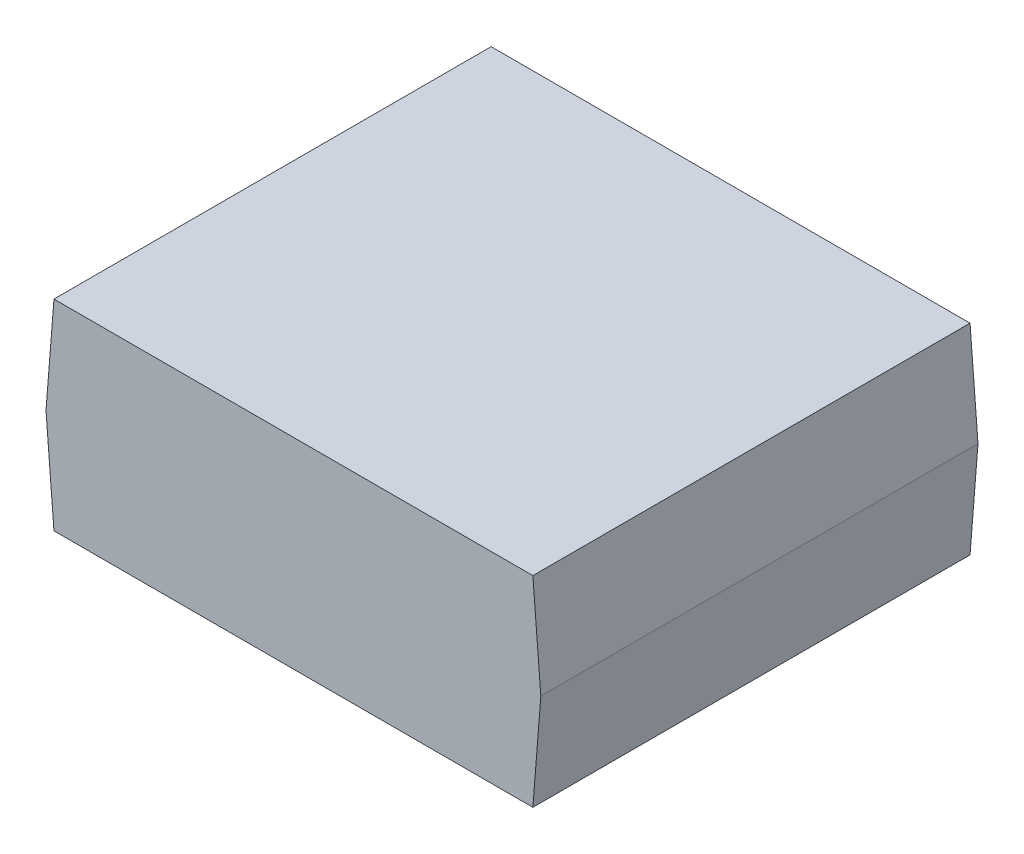
ISO-10303-21;
HEADER;
FILE_DESCRIPTION(('STEP AP214'),'2;1');
FILE_NAME('part.step','',(''),(''),'','','');
FILE_SCHEMA(('AUTOMOTIVE_DESIGN { 1 0 10303 214 1 1 1 1 }'));
ENDSEC;
DATA;
#1=APPLICATION_CONTEXT('core data for automotive mechanical design processes');
#2=APPLICATION_PROTOCOL_DEFINITION('international standard','automotive_design',2000,#1);
#3=PRODUCT_CONTEXT('',#1,'mechanical');
#4=PRODUCT('Part','Part','',(#3));
#5=PRODUCT_RELATED_PRODUCT_CATEGORY('part','',(#4));
#6=PRODUCT_DEFINITION_FORMATION('','',#4);
#7=PRODUCT_DEFINITION_CONTEXT('part definition',#1,'design');
#8=PRODUCT_DEFINITION('design','',#6,#7);
#9=PRODUCT_DEFINITION_SHAPE('','',#8);
#10=(LENGTH_UNIT() NAMED_UNIT(*) SI_UNIT(.MILLI.,.METRE.));
#11=(NAMED_UNIT(*) PLANE_ANGLE_UNIT() SI_UNIT($,.RADIAN.));
#12=(NAMED_UNIT(*) SI_UNIT($,.STERADIAN.) SOLID_ANGLE_UNIT());
#13=UNCERTAINTY_MEASURE_WITH_UNIT(LENGTH_MEASURE(1.E-05),#10,'distance_accuracy_value','');
#14=(GEOMETRIC_REPRESENTATION_CONTEXT(3) GLOBAL_UNCERTAINTY_ASSIGNED_CONTEXT((#13)) GLOBAL_UNIT_ASSIGNED_CONTEXT((#10,
#11,#12)) REPRESENTATION_CONTEXT('',''));
#15=CARTESIAN_POINT('',(0.,0.,0.));
#16=DIRECTION('',(0.,0.,1.));
#17=DIRECTION('',(1.,0.,0.));
#18=AXIS2_PLACEMENT_3D('',#15,#16,#17);
#19=CARTESIAN_POINT('',(-120.5,-91.8892465278965,220.));
#20=DIRECTION('',(0.,1.,0.));
#21=DIRECTION('',(-1.,0.,0.));
#22=AXIS2_PLACEMENT_3D('',#19,#20,#21);
#23=PLANE('',#22);
#24=DIRECTION('',(1.,0.,0.));
#25=VECTOR('',#24,1.);
#26=CARTESIAN_POINT('',(-120.5,-91.8892465278965,0.));
#27=LINE('',#26,#25);
#28=CARTESIAN_POINT('',(-120.5,-91.8892465278965,0.));
#29=VERTEX_POINT('',#28);
#30=CARTESIAN_POINT('',(120.5,-91.8892465278964,0.));
#31=VERTEX_POINT('',#30);
#32=EDGE_CURVE('E121',#29,#31,#27,.T.);
#33=ORIENTED_EDGE('',*,*,#32,.T.);
#34=DIRECTION('',(0.,0.,-1.));
#35=VECTOR('',#34,1.);
#36=CARTESIAN_POINT('',(120.5,-91.8892465278964,220.));
#37=LINE('',#36,#35);
#38=CARTESIAN_POINT('',(120.5,-91.8892465278964,220.));
#39=VERTEX_POINT('',#38);
#40=EDGE_CURVE('E11',#39,#31,#37,.T.);
#41=ORIENTED_EDGE('',*,*,#40,.F.);
#42=DIRECTION('',(1.,0.,0.));
#43=VECTOR('',#42,1.);
#44=CARTESIAN_POINT('',(-120.5,-91.8892465278965,220.));
#45=LINE('',#44,#43);
#46=CARTESIAN_POINT('',(-120.5,-91.8892465278965,220.));
#47=VERTEX_POINT('',#46);
#48=EDGE_CURVE('E131',#47,#39,#45,.T.);
#49=ORIENTED_EDGE('',*,*,#48,.F.);
#50=DIRECTION('',(0.,0.,-1.));
#51=VECTOR('',#50,1.);
#52=CARTESIAN_POINT('',(-120.5,-91.8892465278965,220.));
#53=LINE('',#52,#51);
#54=EDGE_CURVE('E117',#47,#29,#53,.T.);
#55=ORIENTED_EDGE('',*,*,#54,.T.);
#56=EDGE_LOOP('',(#33,#41,#49,#55));
#57=FACE_BOUND('',#56,.T.);
#58=ADVANCED_FACE('F37',(#57),#23,.F.);
#59=CARTESIAN_POINT('',(120.5,-91.8892465278964,220.));
#60=DIRECTION('',(-0.996877736548915,0.0789606127959535,0.));
#61=DIRECTION('',(-0.0789606127959535,-0.996877736548915,0.));
#62=AXIS2_PLACEMENT_3D('',#59,#60,#61);
#63=PLANE('',#62);
#64=DIRECTION('',(0.0789606127959535,0.996877736548915,0.));
#65=VECTOR('',#64,1.);
#66=CARTESIAN_POINT('',(120.5,-91.8892465278964,0.));
#67=LINE('',#66,#65);
#68=CARTESIAN_POINT('',(124.5,-41.3892465278965,0.));
#69=VERTEX_POINT('',#68);
#70=EDGE_CURVE('E124',#31,#69,#67,.T.);
#71=ORIENTED_EDGE('',*,*,#70,.T.);
#72=DIRECTION('',(0.,0.,-1.));
#73=VECTOR('',#72,1.);
#74=CARTESIAN_POINT('',(124.5,-41.3892465278965,220.));
#75=LINE('',#74,#73);
#76=CARTESIAN_POINT('',(124.5,-41.3892465278965,220.));
#77=VERTEX_POINT('',#76);
#78=EDGE_CURVE('E45',#77,#69,#75,.T.);
#79=ORIENTED_EDGE('',*,*,#78,.F.);
#80=DIRECTION('',(0.0789606127959535,0.996877736548915,0.));
#81=VECTOR('',#80,1.);
#82=CARTESIAN_POINT('',(120.5,-91.8892465278964,220.));
#83=LINE('',#82,#81);
#84=EDGE_CURVE('E90',#39,#77,#83,.T.);
#85=ORIENTED_EDGE('',*,*,#84,.F.);
#86=ORIENTED_EDGE('',*,*,#40,.T.);
#87=EDGE_LOOP('',(#71,#79,#85,#86));
#88=FACE_BOUND('',#87,.T.);
#89=ADVANCED_FACE('F155',(#88),#63,.F.);
#90=CARTESIAN_POINT('',(120.5,9.11075347210355,220.));
#91=DIRECTION('',(-0.996877736548915,-0.0789606127959537,0.));
#92=DIRECTION('',(0.0789606127959537,-0.996877736548915,0.));
#93=AXIS2_PLACEMENT_3D('',#90,#91,#92);
#94=PLANE('',#93);
#95=DIRECTION('',(-0.0789606127959537,0.996877736548915,0.));
#96=VECTOR('',#95,1.);
#97=CARTESIAN_POINT('',(120.5,9.11075347210355,0.));
#98=LINE('',#97,#96);
#99=CARTESIAN_POINT('',(120.5,9.11075347210355,0.));
#100=VERTEX_POINT('',#99);
#101=EDGE_CURVE('E126',#69,#100,#98,.T.);
#102=ORIENTED_EDGE('',*,*,#101,.T.);
#103=DIRECTION('',(0.,0.,-1.));
#104=VECTOR('',#103,1.);
#105=CARTESIAN_POINT('',(120.5,9.11075347210355,220.));
#106=LINE('',#105,#104);
#107=CARTESIAN_POINT('',(120.5,9.11075347210355,220.));
#108=VERTEX_POINT('',#107);
#109=EDGE_CURVE('E112',#108,#100,#106,.T.);
#110=ORIENTED_EDGE('',*,*,#109,.F.);
#111=DIRECTION('',(-0.0789606127959537,0.996877736548915,0.));
#112=VECTOR('',#111,1.);
#113=CARTESIAN_POINT('',(120.5,9.11075347210355,220.));
#114=LINE('',#113,#112);
#115=EDGE_CURVE('E103',#77,#108,#114,.T.);
#116=ORIENTED_EDGE('',*,*,#115,.F.);
#117=ORIENTED_EDGE('',*,*,#78,.T.);
#118=EDGE_LOOP('',(#102,#110,#116,#117));
#119=FACE_BOUND('',#118,.T.);
#120=ADVANCED_FACE('F137',(#119),#94,.F.);
#121=CARTESIAN_POINT('',(-120.5,9.11075347210355,220.));
#122=DIRECTION('',(0.,-1.,0.));
#123=DIRECTION('',(0.,0.,-1.));
#124=AXIS2_PLACEMENT_3D('',#121,#122,#123);
#125=PLANE('',#124);
#126=DIRECTION('',(-1.,0.,0.));
#127=VECTOR('',#126,1.);
#128=CARTESIAN_POINT('',(-120.5,9.11075347210355,0.));
#129=LINE('',#128,#127);
#130=CARTESIAN_POINT('',(-120.5,9.11075347210355,0.));
#131=VERTEX_POINT('',#130);
#132=EDGE_CURVE('E111',#100,#131,#129,.T.);
#133=ORIENTED_EDGE('',*,*,#132,.T.);
#134=DIRECTION('',(0.,0.,-1.));
#135=VECTOR('',#134,1.);
#136=CARTESIAN_POINT('',(-120.5,9.11075347210355,220.));
#137=LINE('',#136,#135);
#138=CARTESIAN_POINT('',(-120.5,9.11075347210355,220.));
#139=VERTEX_POINT('',#138);
#140=EDGE_CURVE('E108',#139,#131,#137,.T.);
#141=ORIENTED_EDGE('',*,*,#140,.F.);
#142=DIRECTION('',(-1.,0.,0.));
#143=VECTOR('',#142,1.);
#144=CARTESIAN_POINT('',(-120.5,9.11075347210355,220.));
#145=LINE('',#144,#143);
#146=EDGE_CURVE('E97',#108,#139,#145,.T.);
#147=ORIENTED_EDGE('',*,*,#146,.F.);
#148=ORIENTED_EDGE('',*,*,#109,.T.);
#149=EDGE_LOOP('',(#133,#141,#147,#148));
#150=FACE_BOUND('',#149,.T.);
#151=ADVANCED_FACE('F109',(#150),#125,.F.);
#152=CARTESIAN_POINT('',(-120.5,9.11075347210355,220.));
#153=DIRECTION('',(0.996877736548915,-0.0789606127959537,0.));
#154=DIRECTION('',(0.0789606127959537,0.996877736548915,0.));
#155=AXIS2_PLACEMENT_3D('',#152,#153,#154);
#156=PLANE('',#155);
#157=DIRECTION('',(-0.0789606127959537,-0.996877736548915,0.));
#158=VECTOR('',#157,1.);
#159=CARTESIAN_POINT('',(-120.5,9.11075347210355,0.));
#160=LINE('',#159,#158);
#161=CARTESIAN_POINT('',(-124.5,-41.3892465278965,0.));
#162=VERTEX_POINT('',#161);
#163=EDGE_CURVE('E76',#131,#162,#160,.T.);
#164=ORIENTED_EDGE('',*,*,#163,.T.);
#165=DIRECTION('',(0.,0.,-1.));
#166=VECTOR('',#165,1.);
#167=CARTESIAN_POINT('',(-124.5,-41.3892465278965,220.));
#168=LINE('',#167,#166);
#169=CARTESIAN_POINT('',(-124.5,-41.3892465278965,220.));
#170=VERTEX_POINT('',#169);
#171=EDGE_CURVE('E113',#170,#162,#168,.T.);
#172=ORIENTED_EDGE('',*,*,#171,.F.);
#173=DIRECTION('',(-0.0789606127959537,-0.996877736548915,0.));
#174=VECTOR('',#173,1.);
#175=CARTESIAN_POINT('',(-120.5,9.11075347210355,220.));
#176=LINE('',#175,#174);
#177=EDGE_CURVE('E101',#139,#170,#176,.T.);
#178=ORIENTED_EDGE('',*,*,#177,.F.);
#179=ORIENTED_EDGE('',*,*,#140,.T.);
#180=EDGE_LOOP('',(#164,#172,#178,#179));
#181=FACE_BOUND('',#180,.T.);
#182=ADVANCED_FACE('F115',(#181),#156,.F.);
#183=CARTESIAN_POINT('',(-120.5,-91.8892465278965,220.));
#184=DIRECTION('',(0.996877736548915,0.0789606127959537,0.));
#185=DIRECTION('',(-0.0789606127959537,0.996877736548915,0.));
#186=AXIS2_PLACEMENT_3D('',#183,#184,#185);
#187=PLANE('',#186);
#188=DIRECTION('',(0.0789606127959536,-0.996877736548915,0.));
#189=VECTOR('',#188,1.);
#190=CARTESIAN_POINT('',(-120.5,-91.8892465278965,0.));
#191=LINE('',#190,#189);
#192=EDGE_CURVE('E82',#162,#29,#191,.T.);
#193=ORIENTED_EDGE('',*,*,#192,.T.);
#194=ORIENTED_EDGE('',*,*,#54,.F.);
#195=DIRECTION('',(0.0789606127959536,-0.996877736548915,0.));
#196=VECTOR('',#195,1.);
#197=CARTESIAN_POINT('',(-120.5,-91.8892465278965,220.));
#198=LINE('',#197,#196);
#199=EDGE_CURVE('E53',#170,#47,#198,.T.);
#200=ORIENTED_EDGE('',*,*,#199,.F.);
#201=ORIENTED_EDGE('',*,*,#171,.T.);
#202=EDGE_LOOP('',(#193,#194,#200,#201));
#203=FACE_BOUND('',#202,.T.);
#204=ADVANCED_FACE('F144',(#203),#187,.F.);
#205=CARTESIAN_POINT('',(0.,0.,220.));
#206=DIRECTION('',(0.,0.,1.));
#207=DIRECTION('',(1.,0.,0.));
#208=AXIS2_PLACEMENT_3D('',#205,#206,#207);
#209=PLANE('',#208);
#210=ORIENTED_EDGE('',*,*,#48,.T.);
#211=ORIENTED_EDGE('',*,*,#84,.T.);
#212=ORIENTED_EDGE('',*,*,#115,.T.);
#213=ORIENTED_EDGE('',*,*,#146,.T.);
#214=ORIENTED_EDGE('',*,*,#177,.T.);
#215=ORIENTED_EDGE('',*,*,#199,.T.);
#216=EDGE_LOOP('',(#210,#211,#212,#213,#214,#215));
#217=FACE_BOUND('',#216,.T.);
#218=ADVANCED_FACE('F99',(#217),#209,.T.);
#219=CARTESIAN_POINT('',(0.,0.,0.));
#220=DIRECTION('',(0.,0.,1.));
#221=DIRECTION('',(1.,0.,0.));
#222=AXIS2_PLACEMENT_3D('',#219,#220,#221);
#223=PLANE('',#222);
#224=ORIENTED_EDGE('',*,*,#32,.F.);
#225=ORIENTED_EDGE('',*,*,#192,.F.);
#226=ORIENTED_EDGE('',*,*,#163,.F.);
#227=ORIENTED_EDGE('',*,*,#132,.F.);
#228=ORIENTED_EDGE('',*,*,#101,.F.);
#229=ORIENTED_EDGE('',*,*,#70,.F.);
#230=EDGE_LOOP('',(#224,#225,#226,#227,#228,#229));
#231=FACE_BOUND('',#230,.T.);
#232=ADVANCED_FACE('F140',(#231),#223,.F.);
#233=CLOSED_SHELL('',(#58,#89,#120,#151,#182,#204,#218,#232));
#234=MANIFOLD_SOLID_BREP('B2',#233);
#235=ADVANCED_BREP_SHAPE_REPRESENTATION('',(#18,#234),#14);
#236=SHAPE_DEFINITION_REPRESENTATION(#9,#235);
ENDSEC;
END-ISO-10303-21;
